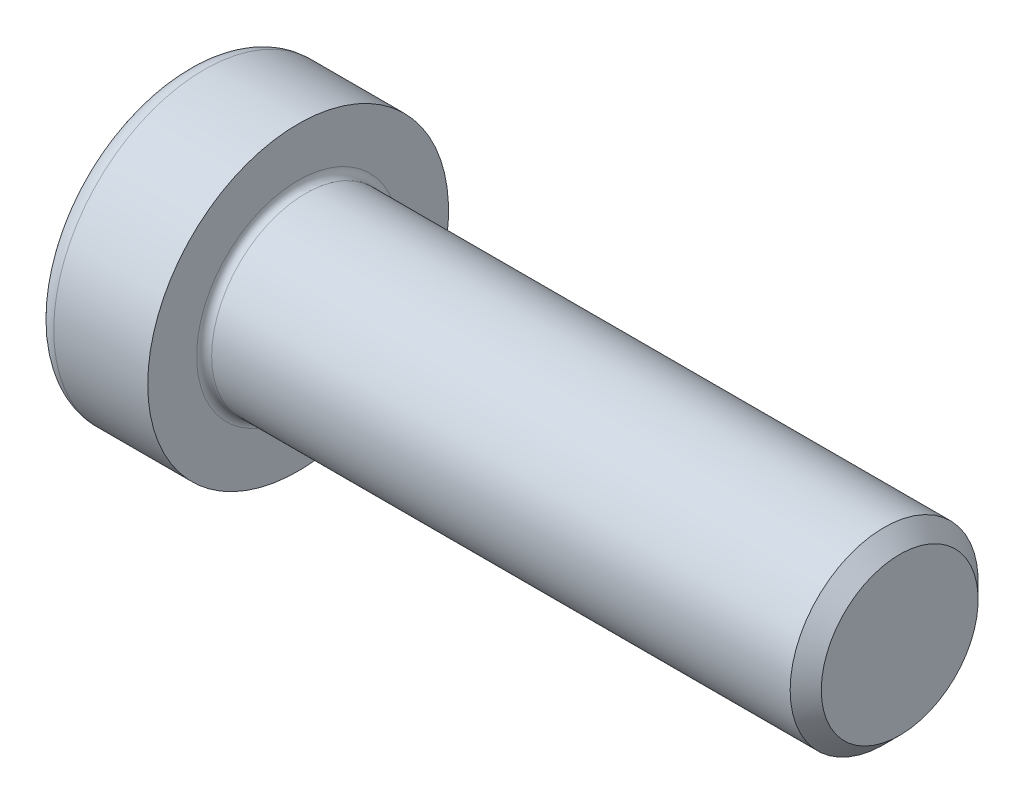
ISO-10303-21;
HEADER;
FILE_DESCRIPTION(('STEP AP214'),'2;1');
FILE_NAME('part.step','',(''),(''),'','','');
FILE_SCHEMA(('AUTOMOTIVE_DESIGN { 1 0 10303 214 1 1 1 1 }'));
ENDSEC;
DATA;
#1=APPLICATION_CONTEXT('core data for automotive mechanical design processes');
#2=APPLICATION_PROTOCOL_DEFINITION('international standard','automotive_design',2000,#1);
#3=PRODUCT_CONTEXT('',#1,'mechanical');
#4=PRODUCT('Part','Part','',(#3));
#5=PRODUCT_RELATED_PRODUCT_CATEGORY('part','',(#4));
#6=PRODUCT_DEFINITION_FORMATION('','',#4);
#7=PRODUCT_DEFINITION_CONTEXT('part definition',#1,'design');
#8=PRODUCT_DEFINITION('design','',#6,#7);
#9=PRODUCT_DEFINITION_SHAPE('','',#8);
#10=(LENGTH_UNIT() NAMED_UNIT(*) SI_UNIT(.MILLI.,.METRE.));
#11=(NAMED_UNIT(*) PLANE_ANGLE_UNIT() SI_UNIT($,.RADIAN.));
#12=(NAMED_UNIT(*) SI_UNIT($,.STERADIAN.) SOLID_ANGLE_UNIT());
#13=UNCERTAINTY_MEASURE_WITH_UNIT(LENGTH_MEASURE(1.E-05),#10,'distance_accuracy_value','');
#14=(GEOMETRIC_REPRESENTATION_CONTEXT(3) GLOBAL_UNCERTAINTY_ASSIGNED_CONTEXT((#13)) GLOBAL_UNIT_ASSIGNED_CONTEXT((#10,
#11,#12)) REPRESENTATION_CONTEXT('',''));
#15=CARTESIAN_POINT('',(0.,0.,0.));
#16=DIRECTION('',(0.,0.,1.));
#17=DIRECTION('',(1.,0.,0.));
#18=AXIS2_PLACEMENT_3D('',#15,#16,#17);
#19=CARTESIAN_POINT('',(0.,0.,0.));
#20=DIRECTION('',(-1.,0.,0.));
#21=DIRECTION('',(0.,0.,1.));
#22=AXIS2_PLACEMENT_3D('',#19,#20,#21);
#23=PLANE('',#22);
#24=DIRECTION('',(0.,-0.499999999999997,0.86602540378444));
#25=VECTOR('',#24,1.);
#26=CARTESIAN_POINT('',(0.,4.04145188432738,0.));
#27=LINE('',#26,#25);
#28=CARTESIAN_POINT('',(0.,4.04145188432738,0.));
#29=VERTEX_POINT('',#28);
#30=CARTESIAN_POINT('',(0.,2.0207259421637,3.49999999999999));
#31=VERTEX_POINT('',#30);
#32=EDGE_CURVE('E302',#29,#31,#27,.T.);
#33=ORIENTED_EDGE('',*,*,#32,.T.);
#34=DIRECTION('',(0.,1.,0.));
#35=VECTOR('',#34,1.);
#36=CARTESIAN_POINT('',(0.,-2.02072594216367,3.5));
#37=LINE('',#36,#35);
#38=CARTESIAN_POINT('',(0.,-2.02072594216367,3.5));
#39=VERTEX_POINT('',#38);
#40=EDGE_CURVE('E143',#39,#31,#37,.T.);
#41=ORIENTED_EDGE('',*,*,#40,.F.);
#42=DIRECTION('',(0.,-0.500000000000001,-0.866025403784438));
#43=VECTOR('',#42,1.);
#44=CARTESIAN_POINT('',(0.,-2.02072594216367,3.5));
#45=LINE('',#44,#43);
#46=CARTESIAN_POINT('',(0.,-4.04145188432737,0.));
#47=VERTEX_POINT('',#46);
#48=EDGE_CURVE('E307',#39,#47,#45,.T.);
#49=ORIENTED_EDGE('',*,*,#48,.T.);
#50=DIRECTION('',(0.,0.499999999999997,-0.86602540378444));
#51=VECTOR('',#50,1.);
#52=CARTESIAN_POINT('',(0.,-4.04145188432737,0.));
#53=LINE('',#52,#51);
#54=CARTESIAN_POINT('',(0.,-2.02072594216369,-3.5));
#55=VERTEX_POINT('',#54);
#56=EDGE_CURVE('E311',#47,#55,#53,.T.);
#57=ORIENTED_EDGE('',*,*,#56,.T.);
#58=DIRECTION('',(0.,-1.,0.));
#59=VECTOR('',#58,1.);
#60=CARTESIAN_POINT('',(0.,2.02072594216369,-3.50000000000001));
#61=LINE('',#60,#59);
#62=CARTESIAN_POINT('',(0.,2.02072594216369,-3.50000000000001));
#63=VERTEX_POINT('',#62);
#64=EDGE_CURVE('E315',#63,#55,#61,.T.);
#65=ORIENTED_EDGE('',*,*,#64,.F.);
#66=DIRECTION('',(0.,-0.500000000000001,-0.866025403784438));
#67=VECTOR('',#66,1.);
#68=CARTESIAN_POINT('',(0.,4.04145188432738,0.));
#69=LINE('',#68,#67);
#70=EDGE_CURVE('E138',#29,#63,#69,.T.);
#71=ORIENTED_EDGE('',*,*,#70,.F.);
#72=EDGE_LOOP('',(#33,#41,#49,#57,#65,#71));
#73=FACE_BOUND('',#72,.T.);
#74=CARTESIAN_POINT('',(0.,0.,0.));
#75=DIRECTION('',(-1.,0.,0.));
#76=DIRECTION('',(0.,0.,1.));
#77=AXIS2_PLACEMENT_3D('',#74,#75,#76);
#78=CIRCLE('',#77,7.);
#79=CARTESIAN_POINT('',(0.,0.,7.));
#80=VERTEX_POINT('',#79);
#81=EDGE_CURVE('E57',#80,#80,#78,.T.);
#82=ORIENTED_EDGE('',*,*,#81,.T.);
#83=EDGE_LOOP('',(#82));
#84=FACE_BOUND('',#83,.T.);
#85=ADVANCED_FACE('F48',(#73,#84),#23,.T.);
#86=CARTESIAN_POINT('',(-31.75,0.,0.));
#87=DIRECTION('',(-1.,0.,0.));
#88=DIRECTION('',(0.,0.,1.));
#89=AXIS2_PLACEMENT_3D('',#86,#87,#88);
#90=CYLINDRICAL_SURFACE('',#89,8.);
#91=CARTESIAN_POINT('',(1.,0.,0.));
#92=DIRECTION('',(-1.,0.,0.));
#93=DIRECTION('',(0.,0.,1.));
#94=AXIS2_PLACEMENT_3D('',#91,#92,#93);
#95=CIRCLE('',#94,8.);
#96=CARTESIAN_POINT('',(1.,0.,8.));
#97=VERTEX_POINT('',#96);
#98=EDGE_CURVE('E11',#97,#97,#95,.F.);
#99=ORIENTED_EDGE('',*,*,#98,.T.);
#100=EDGE_LOOP('',(#99));
#101=FACE_BOUND('',#100,.T.);
#102=CARTESIAN_POINT('',(6.,0.,0.));
#103=DIRECTION('',(-1.,0.,0.));
#104=DIRECTION('',(0.,0.,1.));
#105=AXIS2_PLACEMENT_3D('',#102,#103,#104);
#106=CIRCLE('',#105,8.);
#107=CARTESIAN_POINT('',(6.,0.,8.));
#108=VERTEX_POINT('',#107);
#109=EDGE_CURVE('E168',#108,#108,#106,.T.);
#110=ORIENTED_EDGE('',*,*,#109,.T.);
#111=EDGE_LOOP('',(#110));
#112=FACE_BOUND('',#111,.T.);
#113=ADVANCED_FACE('F198',(#101,#112),#90,.T.);
#114=CARTESIAN_POINT('',(6.,8.,0.));
#115=DIRECTION('',(1.,0.,0.));
#116=DIRECTION('',(0.,0.,-1.));
#117=AXIS2_PLACEMENT_3D('',#114,#115,#116);
#118=PLANE('',#117);
#119=CARTESIAN_POINT('',(6.,0.,0.));
#120=DIRECTION('',(1.,0.,0.));
#121=DIRECTION('',(0.,0.,-1.));
#122=AXIS2_PLACEMENT_3D('',#119,#120,#121);
#123=CIRCLE('',#122,5.4);
#124=CARTESIAN_POINT('',(6.,0.,-5.4));
#125=VERTEX_POINT('',#124);
#126=EDGE_CURVE('E172',#125,#125,#123,.F.);
#127=ORIENTED_EDGE('',*,*,#126,.T.);
#128=EDGE_LOOP('',(#127));
#129=FACE_BOUND('',#128,.T.);
#130=ORIENTED_EDGE('',*,*,#109,.F.);
#131=EDGE_LOOP('',(#130));
#132=FACE_BOUND('',#131,.T.);
#133=ADVANCED_FACE('F203',(#129,#132),#118,.T.);
#134=CARTESIAN_POINT('',(-31.75,0.,0.));
#135=DIRECTION('',(-1.,0.,0.));
#136=DIRECTION('',(0.,0.,1.));
#137=AXIS2_PLACEMENT_3D('',#134,#135,#136);
#138=CYLINDRICAL_SURFACE('',#137,5.);
#139=CARTESIAN_POINT('',(6.4,0.,0.));
#140=DIRECTION('',(1.,0.,0.));
#141=DIRECTION('',(0.,0.,-1.));
#142=AXIS2_PLACEMENT_3D('',#139,#140,#141);
#143=CIRCLE('',#142,5.);
#144=CARTESIAN_POINT('',(6.4,0.,-5.));
#145=VERTEX_POINT('',#144);
#146=EDGE_CURVE('E176',#145,#145,#143,.T.);
#147=ORIENTED_EDGE('',*,*,#146,.T.);
#148=EDGE_LOOP('',(#147));
#149=FACE_BOUND('',#148,.T.);
#150=CARTESIAN_POINT('',(37.172,0.,0.));
#151=DIRECTION('',(-1.,0.,0.));
#152=DIRECTION('',(0.,0.,1.));
#153=AXIS2_PLACEMENT_3D('',#150,#151,#152);
#154=CIRCLE('',#153,5.);
#155=CARTESIAN_POINT('',(37.172,0.,5.));
#156=VERTEX_POINT('',#155);
#157=EDGE_CURVE('E164',#156,#156,#154,.T.);
#158=ORIENTED_EDGE('',*,*,#157,.T.);
#159=EDGE_LOOP('',(#158));
#160=FACE_BOUND('',#159,.T.);
#161=ADVANCED_FACE('F209',(#149,#160),#138,.T.);
#162=CARTESIAN_POINT('',(38.,0.,0.));
#163=DIRECTION('',(-1.,0.,0.));
#164=DIRECTION('',(0.,0.,1.));
#165=AXIS2_PLACEMENT_3D('',#162,#163,#164);
#166=CONICAL_SURFACE('',#165,4.172,0.785398163397451);
#167=ORIENTED_EDGE('',*,*,#157,.F.);
#168=EDGE_LOOP('',(#167));
#169=FACE_BOUND('',#168,.T.);
#170=CARTESIAN_POINT('',(38.,0.,0.));
#171=DIRECTION('',(-1.,0.,0.));
#172=DIRECTION('',(0.,0.,1.));
#173=AXIS2_PLACEMENT_3D('',#170,#171,#172);
#174=CIRCLE('',#173,4.172);
#175=CARTESIAN_POINT('',(38.,0.,4.172));
#176=VERTEX_POINT('',#175);
#177=EDGE_CURVE('E159',#176,#176,#174,.T.);
#178=ORIENTED_EDGE('',*,*,#177,.T.);
#179=EDGE_LOOP('',(#178));
#180=FACE_BOUND('',#179,.T.);
#181=ADVANCED_FACE('F213',(#169,#180),#166,.T.);
#182=CARTESIAN_POINT('',(38.,4.172,0.));
#183=DIRECTION('',(1.,0.,0.));
#184=DIRECTION('',(0.,0.,-1.));
#185=AXIS2_PLACEMENT_3D('',#182,#183,#184);
#186=PLANE('',#185);
#187=ORIENTED_EDGE('',*,*,#177,.F.);
#188=EDGE_LOOP('',(#187));
#189=FACE_BOUND('',#188,.T.);
#190=ADVANCED_FACE('F195',(#189),#186,.T.);
#191=CARTESIAN_POINT('',(6.4,0.,0.));
#192=DIRECTION('',(1.,0.,0.));
#193=DIRECTION('',(0.,0.,-1.));
#194=AXIS2_PLACEMENT_3D('',#191,#192,#193);
#195=TOROIDAL_SURFACE('',#194,5.4,0.4);
#196=ORIENTED_EDGE('',*,*,#146,.F.);
#197=EDGE_LOOP('',(#196));
#198=FACE_BOUND('',#197,.T.);
#199=ORIENTED_EDGE('',*,*,#126,.F.);
#200=EDGE_LOOP('',(#199));
#201=FACE_BOUND('',#200,.T.);
#202=ADVANCED_FACE('F186',(#198,#201),#195,.F.);
#203=CARTESIAN_POINT('',(1.,0.,0.));
#204=DIRECTION('',(-1.,0.,0.));
#205=DIRECTION('',(0.,0.,1.));
#206=AXIS2_PLACEMENT_3D('',#203,#204,#205);
#207=TOROIDAL_SURFACE('',#206,7.,1.);
#208=ORIENTED_EDGE('',*,*,#98,.F.);
#209=EDGE_LOOP('',(#208));
#210=FACE_BOUND('',#209,.T.);
#211=ORIENTED_EDGE('',*,*,#81,.F.);
#212=EDGE_LOOP('',(#211));
#213=FACE_BOUND('',#212,.T.);
#214=ADVANCED_FACE('F50',(#210,#213),#207,.T.);
#215=CARTESIAN_POINT('',(4.5,4.04145188432738,0.));
#216=DIRECTION('',(0.,-0.86602540378444,-0.499999999999997));
#217=DIRECTION('',(0.,0.499999999999997,-0.86602540378444));
#218=AXIS2_PLACEMENT_3D('',#215,#216,#217);
#219=PLANE('',#218);
#220=ORIENTED_EDGE('',*,*,#32,.F.);
#221=DIRECTION('',(-1.,0.,0.));
#222=VECTOR('',#221,1.);
#223=CARTESIAN_POINT('',(4.5,4.04145188432738,0.));
#224=LINE('',#223,#222);
#225=CARTESIAN_POINT('',(4.5,4.04145188432738,0.));
#226=VERTEX_POINT('',#225);
#227=EDGE_CURVE('E301',#226,#29,#224,.T.);
#228=ORIENTED_EDGE('',*,*,#227,.F.);
#229=DIRECTION('',(0.,-0.499999999999997,0.86602540378444));
#230=VECTOR('',#229,1.);
#231=CARTESIAN_POINT('',(4.5,4.04145188432738,0.));
#232=LINE('',#231,#230);
#233=CARTESIAN_POINT('',(4.5,3.03108891324554,1.74999999999999));
#234=VERTEX_POINT('',#233);
#235=EDGE_CURVE('E64',#226,#234,#232,.T.);
#236=ORIENTED_EDGE('',*,*,#235,.T.);
#237=CARTESIAN_POINT('',(4.5,2.0207259421637,3.49999999999999));
#238=VERTEX_POINT('',#237);
#239=EDGE_CURVE('E122',#234,#238,#232,.T.);
#240=ORIENTED_EDGE('',*,*,#239,.T.);
#241=DIRECTION('',(-1.,0.,0.));
#242=VECTOR('',#241,1.);
#243=CARTESIAN_POINT('',(4.5,2.0207259421637,3.49999999999999));
#244=LINE('',#243,#242);
#245=EDGE_CURVE('E135',#238,#31,#244,.T.);
#246=ORIENTED_EDGE('',*,*,#245,.T.);
#247=EDGE_LOOP('',(#220,#228,#236,#240,#246));
#248=FACE_BOUND('',#247,.T.);
#249=ADVANCED_FACE('F134',(#248),#219,.T.);
#250=CARTESIAN_POINT('',(4.5,-2.02072594216367,3.5));
#251=DIRECTION('',(0.,0.,1.));
#252=DIRECTION('',(0.,-1.,0.));
#253=AXIS2_PLACEMENT_3D('',#250,#251,#252);
#254=PLANE('',#253);
#255=ORIENTED_EDGE('',*,*,#40,.T.);
#256=ORIENTED_EDGE('',*,*,#245,.F.);
#257=DIRECTION('',(0.,1.,0.));
#258=VECTOR('',#257,1.);
#259=CARTESIAN_POINT('',(4.5,-2.02072594216367,3.5));
#260=LINE('',#259,#258);
#261=CARTESIAN_POINT('',(4.5,0.,3.49999999999999));
#262=VERTEX_POINT('',#261);
#263=EDGE_CURVE('E120',#262,#238,#260,.T.);
#264=ORIENTED_EDGE('',*,*,#263,.F.);
#265=CARTESIAN_POINT('',(4.5,-2.02072594216367,3.5));
#266=VERTEX_POINT('',#265);
#267=EDGE_CURVE('E131',#266,#262,#260,.T.);
#268=ORIENTED_EDGE('',*,*,#267,.F.);
#269=DIRECTION('',(-1.,0.,0.));
#270=VECTOR('',#269,1.);
#271=CARTESIAN_POINT('',(4.5,-2.02072594216367,3.5));
#272=LINE('',#271,#270);
#273=EDGE_CURVE('E146',#266,#39,#272,.T.);
#274=ORIENTED_EDGE('',*,*,#273,.T.);
#275=EDGE_LOOP('',(#255,#256,#264,#268,#274));
#276=FACE_BOUND('',#275,.T.);
#277=ADVANCED_FACE('F140',(#276),#254,.F.);
#278=CARTESIAN_POINT('',(4.5,-2.02072594216367,3.5));
#279=DIRECTION('',(0.,0.866025403784438,-0.500000000000001));
#280=DIRECTION('',(0.,0.500000000000001,0.866025403784438));
#281=AXIS2_PLACEMENT_3D('',#278,#279,#280);
#282=PLANE('',#281);
#283=ORIENTED_EDGE('',*,*,#48,.F.);
#284=ORIENTED_EDGE('',*,*,#273,.F.);
#285=DIRECTION('',(0.,-0.500000000000001,-0.866025403784438));
#286=VECTOR('',#285,1.);
#287=CARTESIAN_POINT('',(4.5,-2.02072594216367,3.5));
#288=LINE('',#287,#286);
#289=CARTESIAN_POINT('',(4.5,-3.03108891324552,1.75));
#290=VERTEX_POINT('',#289);
#291=EDGE_CURVE('E275',#266,#290,#288,.T.);
#292=ORIENTED_EDGE('',*,*,#291,.T.);
#293=CARTESIAN_POINT('',(4.5,-4.04145188432737,0.));
#294=VERTEX_POINT('',#293);
#295=EDGE_CURVE('E277',#290,#294,#288,.T.);
#296=ORIENTED_EDGE('',*,*,#295,.T.);
#297=DIRECTION('',(-1.,0.,0.));
#298=VECTOR('',#297,1.);
#299=CARTESIAN_POINT('',(4.5,-4.04145188432737,0.));
#300=LINE('',#299,#298);
#301=EDGE_CURVE('E154',#294,#47,#300,.T.);
#302=ORIENTED_EDGE('',*,*,#301,.T.);
#303=EDGE_LOOP('',(#283,#284,#292,#296,#302));
#304=FACE_BOUND('',#303,.T.);
#305=ADVANCED_FACE('F226',(#304),#282,.T.);
#306=CARTESIAN_POINT('',(4.5,-4.04145188432737,0.));
#307=DIRECTION('',(0.,0.86602540378444,0.499999999999997));
#308=DIRECTION('',(0.,-0.499999999999998,0.86602540378444));
#309=AXIS2_PLACEMENT_3D('',#306,#307,#308);
#310=PLANE('',#309);
#311=ORIENTED_EDGE('',*,*,#56,.F.);
#312=ORIENTED_EDGE('',*,*,#301,.F.);
#313=DIRECTION('',(0.,0.499999999999997,-0.86602540378444));
#314=VECTOR('',#313,1.);
#315=CARTESIAN_POINT('',(4.5,-4.04145188432737,0.));
#316=LINE('',#315,#314);
#317=CARTESIAN_POINT('',(4.5,-3.03108891324554,-1.74999999999999));
#318=VERTEX_POINT('',#317);
#319=EDGE_CURVE('E280',#294,#318,#316,.T.);
#320=ORIENTED_EDGE('',*,*,#319,.T.);
#321=CARTESIAN_POINT('',(4.5,-2.02072594216369,-3.5));
#322=VERTEX_POINT('',#321);
#323=EDGE_CURVE('E286',#318,#322,#316,.T.);
#324=ORIENTED_EDGE('',*,*,#323,.T.);
#325=DIRECTION('',(-1.,0.,0.));
#326=VECTOR('',#325,1.);
#327=CARTESIAN_POINT('',(4.5,-2.02072594216369,-3.5));
#328=LINE('',#327,#326);
#329=EDGE_CURVE('E328',#322,#55,#328,.T.);
#330=ORIENTED_EDGE('',*,*,#329,.T.);
#331=EDGE_LOOP('',(#311,#312,#320,#324,#330));
#332=FACE_BOUND('',#331,.T.);
#333=ADVANCED_FACE('F229',(#332),#310,.T.);
#334=CARTESIAN_POINT('',(4.5,2.02072594216369,-3.50000000000001));
#335=DIRECTION('',(0.,0.,-1.));
#336=DIRECTION('',(0.,1.,0.));
#337=AXIS2_PLACEMENT_3D('',#334,#335,#336);
#338=PLANE('',#337);
#339=ORIENTED_EDGE('',*,*,#64,.T.);
#340=ORIENTED_EDGE('',*,*,#329,.F.);
#341=DIRECTION('',(0.,-1.,0.));
#342=VECTOR('',#341,1.);
#343=CARTESIAN_POINT('',(4.5,2.02072594216369,-3.50000000000001));
#344=LINE('',#343,#342);
#345=CARTESIAN_POINT('',(4.5,0.,-3.5));
#346=VERTEX_POINT('',#345);
#347=EDGE_CURVE('E293',#346,#322,#344,.T.);
#348=ORIENTED_EDGE('',*,*,#347,.F.);
#349=CARTESIAN_POINT('',(4.5,2.02072594216369,-3.50000000000001));
#350=VERTEX_POINT('',#349);
#351=EDGE_CURVE('E294',#350,#346,#344,.T.);
#352=ORIENTED_EDGE('',*,*,#351,.F.);
#353=DIRECTION('',(-1.,0.,0.));
#354=VECTOR('',#353,1.);
#355=CARTESIAN_POINT('',(4.5,2.02072594216369,-3.50000000000001));
#356=LINE('',#355,#354);
#357=EDGE_CURVE('E324',#350,#63,#356,.T.);
#358=ORIENTED_EDGE('',*,*,#357,.T.);
#359=EDGE_LOOP('',(#339,#340,#348,#352,#358));
#360=FACE_BOUND('',#359,.T.);
#361=ADVANCED_FACE('F233',(#360),#338,.F.);
#362=CARTESIAN_POINT('',(4.5,4.04145188432738,0.));
#363=DIRECTION('',(0.,0.866025403784438,-0.500000000000001));
#364=DIRECTION('',(0.,0.500000000000001,0.866025403784438));
#365=AXIS2_PLACEMENT_3D('',#362,#363,#364);
#366=PLANE('',#365);
#367=ORIENTED_EDGE('',*,*,#70,.T.);
#368=ORIENTED_EDGE('',*,*,#357,.F.);
#369=DIRECTION('',(0.,-0.500000000000001,-0.866025403784438));
#370=VECTOR('',#369,1.);
#371=CARTESIAN_POINT('',(4.5,4.04145188432738,0.));
#372=LINE('',#371,#370);
#373=CARTESIAN_POINT('',(4.5,3.03108891324554,-1.75000000000001));
#374=VERTEX_POINT('',#373);
#375=EDGE_CURVE('E298',#374,#350,#372,.T.);
#376=ORIENTED_EDGE('',*,*,#375,.F.);
#377=EDGE_CURVE('E265',#226,#374,#372,.T.);
#378=ORIENTED_EDGE('',*,*,#377,.F.);
#379=ORIENTED_EDGE('',*,*,#227,.T.);
#380=EDGE_LOOP('',(#367,#368,#376,#378,#379));
#381=FACE_BOUND('',#380,.T.);
#382=ADVANCED_FACE('F237',(#381),#366,.F.);
#383=CARTESIAN_POINT('',(4.5,2.0207259421637,3.49999999999999));
#384=DIRECTION('',(-1.,0.,0.));
#385=DIRECTION('',(0.,0.,1.));
#386=AXIS2_PLACEMENT_3D('',#383,#384,#385);
#387=PLANE('',#386);
#388=CARTESIAN_POINT('',(4.5,0.,0.));
#389=DIRECTION('',(-1.,0.,0.));
#390=DIRECTION('',(0.,0.,1.));
#391=AXIS2_PLACEMENT_3D('',#388,#389,#390);
#392=CIRCLE('',#391,3.5);
#393=EDGE_CURVE('E145',#290,#262,#392,.T.);
#394=ORIENTED_EDGE('',*,*,#393,.F.);
#395=ORIENTED_EDGE('',*,*,#291,.F.);
#396=ORIENTED_EDGE('',*,*,#267,.T.);
#397=EDGE_LOOP('',(#394,#395,#396));
#398=FACE_BOUND('',#397,.T.);
#399=ADVANCED_FACE('F241',(#398),#387,.T.);
#400=EDGE_CURVE('E152',#318,#290,#392,.T.);
#401=ORIENTED_EDGE('',*,*,#400,.F.);
#402=ORIENTED_EDGE('',*,*,#319,.F.);
#403=ORIENTED_EDGE('',*,*,#295,.F.);
#404=EDGE_LOOP('',(#401,#402,#403));
#405=FACE_BOUND('',#404,.T.);
#406=ADVANCED_FACE('F244',(#405),#387,.T.);
#407=EDGE_CURVE('E347',#346,#318,#392,.T.);
#408=ORIENTED_EDGE('',*,*,#407,.F.);
#409=ORIENTED_EDGE('',*,*,#347,.T.);
#410=ORIENTED_EDGE('',*,*,#323,.F.);
#411=EDGE_LOOP('',(#408,#409,#410));
#412=FACE_BOUND('',#411,.T.);
#413=ADVANCED_FACE('F249',(#412),#387,.T.);
#414=EDGE_CURVE('E269',#374,#346,#392,.T.);
#415=ORIENTED_EDGE('',*,*,#414,.F.);
#416=ORIENTED_EDGE('',*,*,#375,.T.);
#417=ORIENTED_EDGE('',*,*,#351,.T.);
#418=EDGE_LOOP('',(#415,#416,#417));
#419=FACE_BOUND('',#418,.T.);
#420=ADVANCED_FACE('F256',(#419),#387,.T.);
#421=EDGE_CURVE('E160',#234,#374,#392,.T.);
#422=ORIENTED_EDGE('',*,*,#421,.F.);
#423=ORIENTED_EDGE('',*,*,#235,.F.);
#424=ORIENTED_EDGE('',*,*,#377,.T.);
#425=EDGE_LOOP('',(#422,#423,#424));
#426=FACE_BOUND('',#425,.T.);
#427=ADVANCED_FACE('F252',(#426),#387,.T.);
#428=EDGE_CURVE('E125',#262,#234,#392,.T.);
#429=ORIENTED_EDGE('',*,*,#428,.F.);
#430=ORIENTED_EDGE('',*,*,#263,.T.);
#431=ORIENTED_EDGE('',*,*,#239,.F.);
#432=EDGE_LOOP('',(#429,#430,#431));
#433=FACE_BOUND('',#432,.T.);
#434=ADVANCED_FACE('F121',(#433),#387,.T.);
#435=CARTESIAN_POINT('',(4.5,0.,0.));
#436=DIRECTION('',(-1.,0.,0.));
#437=DIRECTION('',(0.,0.,1.));
#438=AXIS2_PLACEMENT_3D('',#435,#436,#437);
#439=CONICAL_SURFACE('',#438,3.5,1.04719755119659);
#440=CARTESIAN_POINT('',(6.52072594216371,0.,0.));
#441=VERTEX_POINT('',#440);
#442=VERTEX_LOOP('',#441);
#443=FACE_BOUND('',#442,.T.);
#444=ORIENTED_EDGE('',*,*,#428,.T.);
#445=ORIENTED_EDGE('',*,*,#421,.T.);
#446=ORIENTED_EDGE('',*,*,#414,.T.);
#447=ORIENTED_EDGE('',*,*,#407,.T.);
#448=ORIENTED_EDGE('',*,*,#400,.T.);
#449=ORIENTED_EDGE('',*,*,#393,.T.);
#450=EDGE_LOOP('',(#444,#445,#446,#447,#448,#449));
#451=FACE_BOUND('',#450,.T.);
#452=ADVANCED_FACE('F221',(#443,#451),#439,.F.);
#453=CLOSED_SHELL('',(#85,#113,#133,#161,#181,#190,#202,#214,#249,#277,#305,#333,#361,#382,#399,
#406,#413,#420,#427,#434,#452));
#454=MANIFOLD_SOLID_BREP('B2',#453);
#455=ADVANCED_BREP_SHAPE_REPRESENTATION('',(#18,#454),#14);
#456=SHAPE_DEFINITION_REPRESENTATION(#9,#455);
ENDSEC;
END-ISO-10303-21;
